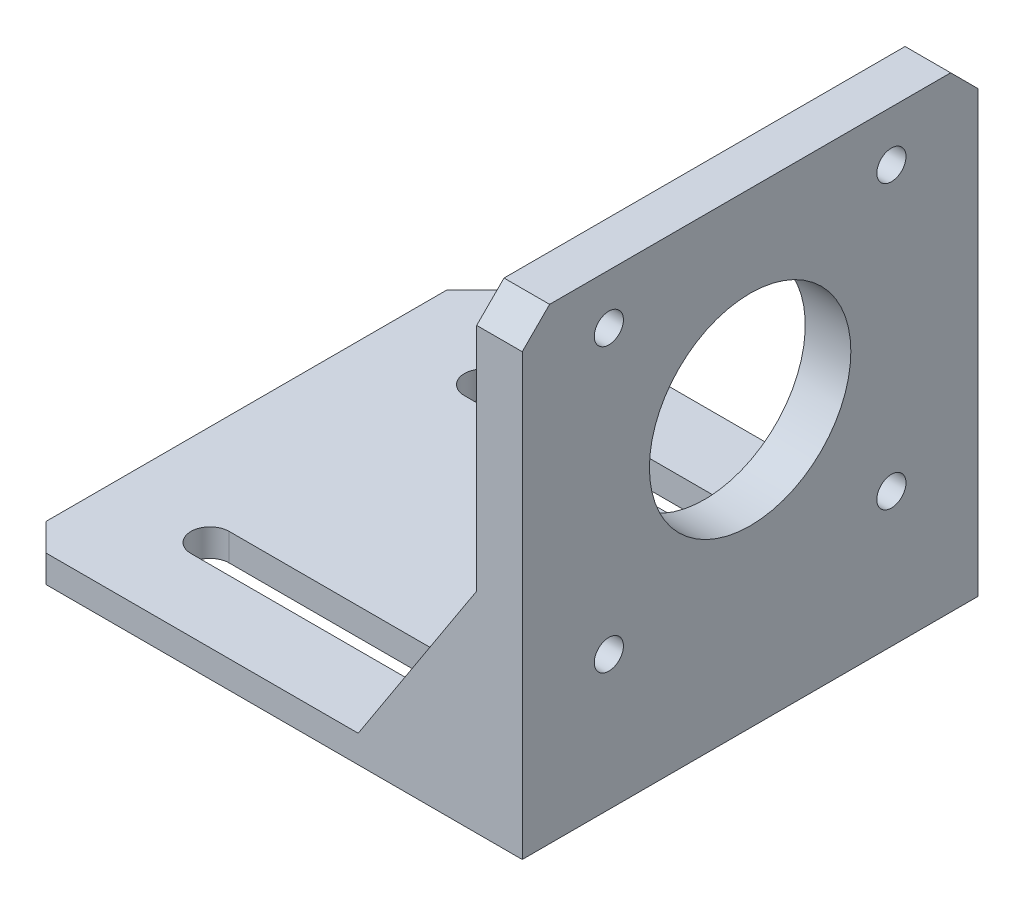
ISO-10303-21;
HEADER;
FILE_DESCRIPTION(('STEP AP214'),'2;1');
FILE_NAME('part.step','',(''),(''),'','','');
FILE_SCHEMA(('AUTOMOTIVE_DESIGN { 1 0 10303 214 1 1 1 1 }'));
ENDSEC;
DATA;
#1=APPLICATION_CONTEXT('core data for automotive mechanical design processes');
#2=APPLICATION_PROTOCOL_DEFINITION('international standard','automotive_design',2000,#1);
#3=PRODUCT_CONTEXT('',#1,'mechanical');
#4=PRODUCT('Part','Part','',(#3));
#5=PRODUCT_RELATED_PRODUCT_CATEGORY('part','',(#4));
#6=PRODUCT_DEFINITION_FORMATION('','',#4);
#7=PRODUCT_DEFINITION_CONTEXT('part definition',#1,'design');
#8=PRODUCT_DEFINITION('design','',#6,#7);
#9=PRODUCT_DEFINITION_SHAPE('','',#8);
#10=(LENGTH_UNIT() NAMED_UNIT(*) SI_UNIT(.MILLI.,.METRE.));
#11=(NAMED_UNIT(*) PLANE_ANGLE_UNIT() SI_UNIT($,.RADIAN.));
#12=(NAMED_UNIT(*) SI_UNIT($,.STERADIAN.) SOLID_ANGLE_UNIT());
#13=UNCERTAINTY_MEASURE_WITH_UNIT(LENGTH_MEASURE(1.E-05),#10,'distance_accuracy_value','');
#14=(GEOMETRIC_REPRESENTATION_CONTEXT(3) GLOBAL_UNCERTAINTY_ASSIGNED_CONTEXT((#13)) GLOBAL_UNIT_ASSIGNED_CONTEXT((#10,
#11,#12)) REPRESENTATION_CONTEXT('',''));
#15=CARTESIAN_POINT('',(0.,0.,0.));
#16=DIRECTION('',(0.,0.,1.));
#17=DIRECTION('',(1.,0.,0.));
#18=AXIS2_PLACEMENT_3D('',#15,#16,#17);
#19=CARTESIAN_POINT('',(0.,-3.,50.));
#20=DIRECTION('',(1.,0.,0.));
#21=DIRECTION('',(0.,0.,-1.));
#22=AXIS2_PLACEMENT_3D('',#19,#20,#21);
#23=PLANE('',#22);
#24=DIRECTION('',(0.,0.,-1.));
#25=VECTOR('',#24,1.);
#26=CARTESIAN_POINT('',(0.,0.,50.));
#27=LINE('',#26,#25);
#28=CARTESIAN_POINT('',(0.,0.,47.));
#29=VERTEX_POINT('',#28);
#30=CARTESIAN_POINT('',(0.,0.,3.00000000000002));
#31=VERTEX_POINT('',#30);
#32=EDGE_CURVE('E476',#29,#31,#27,.T.);
#33=ORIENTED_EDGE('',*,*,#32,.T.);
#34=DIRECTION('',(0.,-1.,0.));
#35=VECTOR('',#34,1.);
#36=CARTESIAN_POINT('',(0.,-3.,3.00000000000002));
#37=LINE('',#36,#35);
#38=CARTESIAN_POINT('',(0.,-3.,3.00000000000002));
#39=VERTEX_POINT('',#38);
#40=EDGE_CURVE('E520',#31,#39,#37,.T.);
#41=ORIENTED_EDGE('',*,*,#40,.T.);
#42=DIRECTION('',(0.,0.,-1.));
#43=VECTOR('',#42,1.);
#44=CARTESIAN_POINT('',(0.,-3.,50.));
#45=LINE('',#44,#43);
#46=CARTESIAN_POINT('',(0.,-3.,47.));
#47=VERTEX_POINT('',#46);
#48=EDGE_CURVE('E487',#47,#39,#45,.T.);
#49=ORIENTED_EDGE('',*,*,#48,.F.);
#50=DIRECTION('',(0.,1.,0.));
#51=VECTOR('',#50,1.);
#52=CARTESIAN_POINT('',(0.,-3.,47.));
#53=LINE('',#52,#51);
#54=EDGE_CURVE('E518',#47,#29,#53,.T.);
#55=ORIENTED_EDGE('',*,*,#54,.T.);
#56=EDGE_LOOP('',(#33,#41,#49,#55));
#57=FACE_BOUND('',#56,.T.);
#58=ADVANCED_FACE('F189',(#57),#23,.F.);
#59=CARTESIAN_POINT('',(53.25,-2.99999999999999,50.));
#60=DIRECTION('',(0.,1.,0.));
#61=DIRECTION('',(-1.,0.,0.));
#62=AXIS2_PLACEMENT_3D('',#59,#60,#61);
#63=PLANE('',#62);
#64=ORIENTED_EDGE('',*,*,#48,.T.);
#65=DIRECTION('',(0.707106781186548,0.,-0.707106781186548));
#66=VECTOR('',#65,1.);
#67=CARTESIAN_POINT('',(0.,-3.,3.00000000000002));
#68=LINE('',#67,#66);
#69=CARTESIAN_POINT('',(3.00000000000002,-3.,0.));
#70=VERTEX_POINT('',#69);
#71=EDGE_CURVE('E525',#39,#70,#68,.T.);
#72=ORIENTED_EDGE('',*,*,#71,.T.);
#73=DIRECTION('',(1.,0.,0.));
#74=VECTOR('',#73,1.);
#75=CARTESIAN_POINT('',(53.25,-2.99999999999999,0.));
#76=LINE('',#75,#74);
#77=CARTESIAN_POINT('',(55.25,-2.99999999999999,0.));
#78=VERTEX_POINT('',#77);
#79=EDGE_CURVE('E469',#70,#78,#76,.T.);
#80=ORIENTED_EDGE('',*,*,#79,.T.);
#81=DIRECTION('',(0.,0.,-1.));
#82=VECTOR('',#81,1.);
#83=CARTESIAN_POINT('',(55.25,-2.99999999999999,0.));
#84=LINE('',#83,#82);
#85=CARTESIAN_POINT('',(55.25,-2.99999999999999,50.));
#86=VERTEX_POINT('',#85);
#87=EDGE_CURVE('E366',#86,#78,#84,.T.);
#88=ORIENTED_EDGE('',*,*,#87,.F.);
#89=DIRECTION('',(1.,0.,0.));
#90=VECTOR('',#89,1.);
#91=CARTESIAN_POINT('',(53.25,-2.99999999999999,50.));
#92=LINE('',#91,#90);
#93=CARTESIAN_POINT('',(3.00000000000002,-3.,50.));
#94=VERTEX_POINT('',#93);
#95=EDGE_CURVE('E362',#94,#86,#92,.T.);
#96=ORIENTED_EDGE('',*,*,#95,.F.);
#97=DIRECTION('',(0.707106781186548,0.,0.707106781186548));
#98=VECTOR('',#97,1.);
#99=CARTESIAN_POINT('',(3.00000000000002,-3.,50.));
#100=LINE('',#99,#98);
#101=EDGE_CURVE('E523',#94,#47,#100,.F.);
#102=ORIENTED_EDGE('',*,*,#101,.T.);
#103=EDGE_LOOP('',(#64,#72,#80,#88,#96,#102));
#104=FACE_BOUND('',#103,.T.);
#105=CARTESIAN_POINT('',(41.,-2.99999999999999,10.));
#106=DIRECTION('',(0.,1.,0.));
#107=DIRECTION('',(-1.,0.,0.));
#108=AXIS2_PLACEMENT_3D('',#105,#106,#107);
#109=CIRCLE('',#108,2.1);
#110=CARTESIAN_POINT('',(41.,-2.99999999999999,12.1));
#111=VERTEX_POINT('',#110);
#112=CARTESIAN_POINT('',(41.,-3.,7.9));
#113=VERTEX_POINT('',#112);
#114=EDGE_CURVE('E508',#111,#113,#109,.T.);
#115=ORIENTED_EDGE('',*,*,#114,.T.);
#116=DIRECTION('',(-1.,0.,0.));
#117=VECTOR('',#116,1.);
#118=CARTESIAN_POINT('',(53.25,-2.99999999999999,7.9));
#119=LINE('',#118,#117);
#120=CARTESIAN_POINT('',(11.,-3.,7.9));
#121=VERTEX_POINT('',#120);
#122=EDGE_CURVE('E511',#113,#121,#119,.T.);
#123=ORIENTED_EDGE('',*,*,#122,.T.);
#124=CARTESIAN_POINT('',(11.,-3.,10.));
#125=DIRECTION('',(0.,1.,0.));
#126=DIRECTION('',(-1.,0.,0.));
#127=AXIS2_PLACEMENT_3D('',#124,#125,#126);
#128=CIRCLE('',#127,2.1);
#129=CARTESIAN_POINT('',(11.,-3.,12.1));
#130=VERTEX_POINT('',#129);
#131=EDGE_CURVE('E505',#121,#130,#128,.T.);
#132=ORIENTED_EDGE('',*,*,#131,.T.);
#133=DIRECTION('',(1.,0.,0.));
#134=VECTOR('',#133,1.);
#135=CARTESIAN_POINT('',(53.25,-2.99999999999999,12.1));
#136=LINE('',#135,#134);
#137=EDGE_CURVE('E502',#130,#111,#136,.T.);
#138=ORIENTED_EDGE('',*,*,#137,.T.);
#139=EDGE_LOOP('',(#115,#123,#132,#138));
#140=FACE_BOUND('',#139,.T.);
#141=CARTESIAN_POINT('',(41.,-2.99999999999999,40.));
#142=DIRECTION('',(0.,1.,0.));
#143=DIRECTION('',(-1.,0.,0.));
#144=AXIS2_PLACEMENT_3D('',#141,#142,#143);
#145=CIRCLE('',#144,2.1);
#146=CARTESIAN_POINT('',(41.,-3.,42.1));
#147=VERTEX_POINT('',#146);
#148=CARTESIAN_POINT('',(41.,-3.,37.9));
#149=VERTEX_POINT('',#148);
#150=EDGE_CURVE('E496',#147,#149,#145,.T.);
#151=ORIENTED_EDGE('',*,*,#150,.T.);
#152=DIRECTION('',(-1.,0.,0.));
#153=VECTOR('',#152,1.);
#154=CARTESIAN_POINT('',(53.25,-2.99999999999999,37.9));
#155=LINE('',#154,#153);
#156=CARTESIAN_POINT('',(11.,-3.,37.9));
#157=VERTEX_POINT('',#156);
#158=EDGE_CURVE('E499',#149,#157,#155,.T.);
#159=ORIENTED_EDGE('',*,*,#158,.T.);
#160=CARTESIAN_POINT('',(11.,-3.,40.));
#161=DIRECTION('',(0.,1.,0.));
#162=DIRECTION('',(-1.,0.,0.));
#163=AXIS2_PLACEMENT_3D('',#160,#161,#162);
#164=CIRCLE('',#163,2.1);
#165=CARTESIAN_POINT('',(11.,-3.,42.1));
#166=VERTEX_POINT('',#165);
#167=EDGE_CURVE('E493',#157,#166,#164,.T.);
#168=ORIENTED_EDGE('',*,*,#167,.T.);
#169=DIRECTION('',(1.,0.,0.));
#170=VECTOR('',#169,1.);
#171=CARTESIAN_POINT('',(53.25,-2.99999999999999,42.1));
#172=LINE('',#171,#170);
#173=EDGE_CURVE('E490',#166,#147,#172,.T.);
#174=ORIENTED_EDGE('',*,*,#173,.T.);
#175=EDGE_LOOP('',(#151,#159,#168,#174));
#176=FACE_BOUND('',#175,.T.);
#177=ADVANCED_FACE('F600',(#104,#140,#176),#63,.F.);
#178=CARTESIAN_POINT('',(50.25,48.25,50.));
#179=DIRECTION('',(0.,-1.,0.));
#180=DIRECTION('',(0.,0.,-1.));
#181=AXIS2_PLACEMENT_3D('',#178,#179,#180);
#182=PLANE('',#181);
#183=DIRECTION('',(1.,0.,0.));
#184=VECTOR('',#183,1.);
#185=CARTESIAN_POINT('',(50.25,48.25,47.));
#186=LINE('',#185,#184);
#187=CARTESIAN_POINT('',(50.25,48.25,47.));
#188=VERTEX_POINT('',#187);
#189=CARTESIAN_POINT('',(55.25,48.25,47.));
#190=VERTEX_POINT('',#189);
#191=EDGE_CURVE('E535',#188,#190,#186,.T.);
#192=ORIENTED_EDGE('',*,*,#191,.T.);
#193=DIRECTION('',(0.,0.,1.));
#194=VECTOR('',#193,1.);
#195=CARTESIAN_POINT('',(55.25,48.25,47.));
#196=LINE('',#195,#194);
#197=CARTESIAN_POINT('',(55.25,48.25,3.00000000000002));
#198=VERTEX_POINT('',#197);
#199=EDGE_CURVE('E373',#198,#190,#196,.T.);
#200=ORIENTED_EDGE('',*,*,#199,.F.);
#201=DIRECTION('',(-1.,0.,0.));
#202=VECTOR('',#201,1.);
#203=CARTESIAN_POINT('',(50.25,48.25,3.00000000000002));
#204=LINE('',#203,#202);
#205=CARTESIAN_POINT('',(50.25,48.25,3.00000000000002));
#206=VERTEX_POINT('',#205);
#207=EDGE_CURVE('E537',#198,#206,#204,.T.);
#208=ORIENTED_EDGE('',*,*,#207,.T.);
#209=DIRECTION('',(0.,0.,-1.));
#210=VECTOR('',#209,1.);
#211=CARTESIAN_POINT('',(50.25,48.25,50.));
#212=LINE('',#211,#210);
#213=EDGE_CURVE('E484',#188,#206,#212,.T.);
#214=ORIENTED_EDGE('',*,*,#213,.F.);
#215=EDGE_LOOP('',(#192,#200,#208,#214));
#216=FACE_BOUND('',#215,.T.);
#217=ADVANCED_FACE('F589',(#216),#182,.F.);
#218=CARTESIAN_POINT('',(50.25,0.,50.));
#219=DIRECTION('',(1.,0.,0.));
#220=DIRECTION('',(0.,0.,-1.));
#221=AXIS2_PLACEMENT_3D('',#218,#219,#220);
#222=PLANE('',#221);
#223=CARTESIAN_POINT('',(50.25,42.75,9.5));
#224=DIRECTION('',(-1.,0.,0.));
#225=DIRECTION('',(0.,0.,1.));
#226=AXIS2_PLACEMENT_3D('',#223,#224,#225);
#227=CIRCLE('',#226,1.60000000000002);
#228=CARTESIAN_POINT('',(50.25,42.75,11.1));
#229=VERTEX_POINT('',#228);
#230=EDGE_CURVE('E454',#229,#229,#227,.T.);
#231=ORIENTED_EDGE('',*,*,#230,.F.);
#232=EDGE_LOOP('',(#231));
#233=FACE_BOUND('',#232,.T.);
#234=CARTESIAN_POINT('',(50.25,42.75,40.5));
#235=DIRECTION('',(-1.,0.,0.));
#236=DIRECTION('',(0.,0.,1.));
#237=AXIS2_PLACEMENT_3D('',#234,#235,#236);
#238=CIRCLE('',#237,1.60000000000002);
#239=CARTESIAN_POINT('',(50.25,42.75,42.1));
#240=VERTEX_POINT('',#239);
#241=EDGE_CURVE('E457',#240,#240,#238,.T.);
#242=ORIENTED_EDGE('',*,*,#241,.F.);
#243=EDGE_LOOP('',(#242));
#244=FACE_BOUND('',#243,.T.);
#245=CARTESIAN_POINT('',(50.25,11.75,40.5));
#246=DIRECTION('',(-1.,0.,0.));
#247=DIRECTION('',(0.,0.,1.));
#248=AXIS2_PLACEMENT_3D('',#245,#246,#247);
#249=CIRCLE('',#248,1.60000000000001);
#250=CARTESIAN_POINT('',(50.25,11.75,42.1));
#251=VERTEX_POINT('',#250);
#252=EDGE_CURVE('E460',#251,#251,#249,.T.);
#253=ORIENTED_EDGE('',*,*,#252,.F.);
#254=EDGE_LOOP('',(#253));
#255=FACE_BOUND('',#254,.T.);
#256=CARTESIAN_POINT('',(50.25,11.75,9.50000000000001));
#257=DIRECTION('',(-1.,0.,0.));
#258=DIRECTION('',(0.,0.,1.));
#259=AXIS2_PLACEMENT_3D('',#256,#257,#258);
#260=CIRCLE('',#259,1.60000000000001);
#261=CARTESIAN_POINT('',(50.25,11.75,11.1));
#262=VERTEX_POINT('',#261);
#263=EDGE_CURVE('E463',#262,#262,#260,.T.);
#264=ORIENTED_EDGE('',*,*,#263,.F.);
#265=EDGE_LOOP('',(#264));
#266=FACE_BOUND('',#265,.T.);
#267=CARTESIAN_POINT('',(50.25,27.25,25.));
#268=DIRECTION('',(-1.,0.,0.));
#269=DIRECTION('',(0.,0.,1.));
#270=AXIS2_PLACEMENT_3D('',#267,#268,#269);
#271=CIRCLE('',#270,11.05);
#272=CARTESIAN_POINT('',(50.25,27.25,36.05));
#273=VERTEX_POINT('',#272);
#274=EDGE_CURVE('E466',#273,#273,#271,.T.);
#275=ORIENTED_EDGE('',*,*,#274,.F.);
#276=EDGE_LOOP('',(#275));
#277=FACE_BOUND('',#276,.T.);
#278=DIRECTION('',(0.,1.,0.));
#279=VECTOR('',#278,1.);
#280=CARTESIAN_POINT('',(50.25,0.,2.1));
#281=LINE('',#280,#279);
#282=CARTESIAN_POINT('',(50.25,4.99999999999999,2.1));
#283=VERTEX_POINT('',#282);
#284=CARTESIAN_POINT('',(50.25,20.,2.1));
#285=VERTEX_POINT('',#284);
#286=EDGE_CURVE('E399',#283,#285,#281,.T.);
#287=ORIENTED_EDGE('',*,*,#286,.F.);
#288=DIRECTION('',(0.,0.,1.));
#289=VECTOR('',#288,1.);
#290=CARTESIAN_POINT('',(50.25,4.99999999999999,47.9));
#291=LINE('',#290,#289);
#292=CARTESIAN_POINT('',(50.25,4.99999999999999,47.9));
#293=VERTEX_POINT('',#292);
#294=EDGE_CURVE('E198',#283,#293,#291,.T.);
#295=ORIENTED_EDGE('',*,*,#294,.T.);
#296=DIRECTION('',(0.,-1.,0.));
#297=VECTOR('',#296,1.);
#298=CARTESIAN_POINT('',(50.25,0.,47.9));
#299=LINE('',#298,#297);
#300=CARTESIAN_POINT('',(50.25,20.,47.9));
#301=VERTEX_POINT('',#300);
#302=EDGE_CURVE('E412',#301,#293,#299,.T.);
#303=ORIENTED_EDGE('',*,*,#302,.F.);
#304=DIRECTION('',(0.,0.,1.));
#305=VECTOR('',#304,1.);
#306=CARTESIAN_POINT('',(50.25,20.,50.));
#307=LINE('',#306,#305);
#308=CARTESIAN_POINT('',(50.25,20.,50.));
#309=VERTEX_POINT('',#308);
#310=EDGE_CURVE('E409',#301,#309,#307,.T.);
#311=ORIENTED_EDGE('',*,*,#310,.T.);
#312=DIRECTION('',(0.,-1.,0.));
#313=VECTOR('',#312,1.);
#314=CARTESIAN_POINT('',(50.25,0.,50.));
#315=LINE('',#314,#313);
#316=CARTESIAN_POINT('',(50.25,45.25,50.));
#317=VERTEX_POINT('',#316);
#318=EDGE_CURVE('E471',#317,#309,#315,.T.);
#319=ORIENTED_EDGE('',*,*,#318,.F.);
#320=DIRECTION('',(0.,-0.707106781186546,0.707106781186549));
#321=VECTOR('',#320,1.);
#322=CARTESIAN_POINT('',(50.25,45.25,50.));
#323=LINE('',#322,#321);
#324=EDGE_CURVE('E350',#317,#188,#323,.F.);
#325=ORIENTED_EDGE('',*,*,#324,.T.);
#326=ORIENTED_EDGE('',*,*,#213,.T.);
#327=DIRECTION('',(0.,-0.707106781186548,-0.707106781186548));
#328=VECTOR('',#327,1.);
#329=CARTESIAN_POINT('',(50.25,48.25,3.00000000000002));
#330=LINE('',#329,#328);
#331=CARTESIAN_POINT('',(50.25,45.25,0.));
#332=VERTEX_POINT('',#331);
#333=EDGE_CURVE('E541',#206,#332,#330,.T.);
#334=ORIENTED_EDGE('',*,*,#333,.T.);
#335=DIRECTION('',(0.,-1.,0.));
#336=VECTOR('',#335,1.);
#337=CARTESIAN_POINT('',(50.25,0.,0.));
#338=LINE('',#337,#336);
#339=CARTESIAN_POINT('',(50.25,20.,0.));
#340=VERTEX_POINT('',#339);
#341=EDGE_CURVE('E478',#332,#340,#338,.T.);
#342=ORIENTED_EDGE('',*,*,#341,.T.);
#343=DIRECTION('',(0.,0.,-1.));
#344=VECTOR('',#343,1.);
#345=CARTESIAN_POINT('',(50.25,20.,50.));
#346=LINE('',#345,#344);
#347=EDGE_CURVE('E396',#340,#285,#346,.F.);
#348=ORIENTED_EDGE('',*,*,#347,.T.);
#349=EDGE_LOOP('',(#287,#295,#303,#311,#319,#325,#326,#334,#342,#348));
#350=FACE_BOUND('',#349,.T.);
#351=ADVANCED_FACE('F586',(#233,#244,#255,#266,#277,#350),#222,.F.);
#352=CARTESIAN_POINT('',(0.,0.,50.));
#353=DIRECTION('',(0.,-1.,0.));
#354=DIRECTION('',(0.,0.,-1.));
#355=AXIS2_PLACEMENT_3D('',#352,#353,#354);
#356=PLANE('',#355);
#357=CARTESIAN_POINT('',(41.,0.,10.));
#358=DIRECTION('',(0.,1.,0.));
#359=DIRECTION('',(0.,0.,1.));
#360=AXIS2_PLACEMENT_3D('',#357,#358,#359);
#361=CIRCLE('',#360,2.1);
#362=CARTESIAN_POINT('',(41.,0.,12.1));
#363=VERTEX_POINT('',#362);
#364=CARTESIAN_POINT('',(41.,0.,7.9));
#365=VERTEX_POINT('',#364);
#366=EDGE_CURVE('E427',#363,#365,#361,.T.);
#367=ORIENTED_EDGE('',*,*,#366,.F.);
#368=DIRECTION('',(1.,0.,0.));
#369=VECTOR('',#368,1.);
#370=CARTESIAN_POINT('',(11.,0.,12.1));
#371=LINE('',#370,#369);
#372=CARTESIAN_POINT('',(11.,0.,12.1));
#373=VERTEX_POINT('',#372);
#374=EDGE_CURVE('E414',#373,#363,#371,.T.);
#375=ORIENTED_EDGE('',*,*,#374,.F.);
#376=CARTESIAN_POINT('',(11.,0.,10.));
#377=DIRECTION('',(0.,1.,0.));
#378=DIRECTION('',(0.,0.,1.));
#379=AXIS2_PLACEMENT_3D('',#376,#377,#378);
#380=CIRCLE('',#379,2.1);
#381=CARTESIAN_POINT('',(11.,0.,7.9));
#382=VERTEX_POINT('',#381);
#383=EDGE_CURVE('E419',#382,#373,#380,.T.);
#384=ORIENTED_EDGE('',*,*,#383,.F.);
#385=DIRECTION('',(1.,0.,0.));
#386=VECTOR('',#385,1.);
#387=CARTESIAN_POINT('',(11.,0.,7.9));
#388=LINE('',#387,#386);
#389=EDGE_CURVE('E416',#382,#365,#388,.T.);
#390=ORIENTED_EDGE('',*,*,#389,.T.);
#391=EDGE_LOOP('',(#367,#375,#384,#390));
#392=FACE_BOUND('',#391,.T.);
#393=CARTESIAN_POINT('',(41.,0.,40.));
#394=DIRECTION('',(0.,1.,0.));
#395=DIRECTION('',(0.,0.,1.));
#396=AXIS2_PLACEMENT_3D('',#393,#394,#395);
#397=CIRCLE('',#396,2.1);
#398=CARTESIAN_POINT('',(41.,0.,42.1));
#399=VERTEX_POINT('',#398);
#400=CARTESIAN_POINT('',(41.,0.,37.9));
#401=VERTEX_POINT('',#400);
#402=EDGE_CURVE('E446',#399,#401,#397,.T.);
#403=ORIENTED_EDGE('',*,*,#402,.F.);
#404=DIRECTION('',(1.,0.,0.));
#405=VECTOR('',#404,1.);
#406=CARTESIAN_POINT('',(11.,0.,42.1));
#407=LINE('',#406,#405);
#408=CARTESIAN_POINT('',(11.,0.,42.1));
#409=VERTEX_POINT('',#408);
#410=EDGE_CURVE('E434',#409,#399,#407,.T.);
#411=ORIENTED_EDGE('',*,*,#410,.F.);
#412=CARTESIAN_POINT('',(11.,0.,40.));
#413=DIRECTION('',(0.,1.,0.));
#414=DIRECTION('',(0.,0.,1.));
#415=AXIS2_PLACEMENT_3D('',#412,#413,#414);
#416=CIRCLE('',#415,2.1);
#417=CARTESIAN_POINT('',(11.,0.,37.9));
#418=VERTEX_POINT('',#417);
#419=EDGE_CURVE('E439',#418,#409,#416,.T.);
#420=ORIENTED_EDGE('',*,*,#419,.F.);
#421=DIRECTION('',(1.,0.,0.));
#422=VECTOR('',#421,1.);
#423=CARTESIAN_POINT('',(11.,0.,37.9));
#424=LINE('',#423,#422);
#425=EDGE_CURVE('E436',#418,#401,#424,.T.);
#426=ORIENTED_EDGE('',*,*,#425,.T.);
#427=EDGE_LOOP('',(#403,#411,#420,#426));
#428=FACE_BOUND('',#427,.T.);
#429=DIRECTION('',(-1.,0.,0.));
#430=VECTOR('',#429,1.);
#431=CARTESIAN_POINT('',(0.,0.,47.9));
#432=LINE('',#431,#430);
#433=CARTESIAN_POINT('',(45.2499999999999,0.,47.9));
#434=VERTEX_POINT('',#433);
#435=CARTESIAN_POINT('',(37.25,0.,47.9));
#436=VERTEX_POINT('',#435);
#437=EDGE_CURVE('E514',#434,#436,#432,.T.);
#438=ORIENTED_EDGE('',*,*,#437,.F.);
#439=DIRECTION('',(0.,0.,-1.));
#440=VECTOR('',#439,1.);
#441=CARTESIAN_POINT('',(45.2499999999999,0.,2.1));
#442=LINE('',#441,#440);
#443=CARTESIAN_POINT('',(45.2499999999999,0.,2.1));
#444=VERTEX_POINT('',#443);
#445=EDGE_CURVE('E543',#434,#444,#442,.T.);
#446=ORIENTED_EDGE('',*,*,#445,.T.);
#447=DIRECTION('',(1.,0.,0.));
#448=VECTOR('',#447,1.);
#449=CARTESIAN_POINT('',(0.,0.,2.1));
#450=LINE('',#449,#448);
#451=CARTESIAN_POINT('',(37.25,0.,2.1));
#452=VERTEX_POINT('',#451);
#453=EDGE_CURVE('E516',#452,#444,#450,.T.);
#454=ORIENTED_EDGE('',*,*,#453,.F.);
#455=DIRECTION('',(0.,0.,1.));
#456=VECTOR('',#455,1.);
#457=CARTESIAN_POINT('',(37.25,0.,50.));
#458=LINE('',#457,#456);
#459=CARTESIAN_POINT('',(37.25,0.,0.));
#460=VERTEX_POINT('',#459);
#461=EDGE_CURVE('E392',#452,#460,#458,.F.);
#462=ORIENTED_EDGE('',*,*,#461,.T.);
#463=DIRECTION('',(-1.,0.,0.));
#464=VECTOR('',#463,1.);
#465=CARTESIAN_POINT('',(0.,0.,0.));
#466=LINE('',#465,#464);
#467=CARTESIAN_POINT('',(3.00000000000002,0.,0.));
#468=VERTEX_POINT('',#467);
#469=EDGE_CURVE('E472',#460,#468,#466,.T.);
#470=ORIENTED_EDGE('',*,*,#469,.T.);
#471=DIRECTION('',(-0.707106781186548,0.,0.707106781186548));
#472=VECTOR('',#471,1.);
#473=CARTESIAN_POINT('',(0.,0.,3.00000000000002));
#474=LINE('',#473,#472);
#475=EDGE_CURVE('E354',#468,#31,#474,.T.);
#476=ORIENTED_EDGE('',*,*,#475,.T.);
#477=ORIENTED_EDGE('',*,*,#32,.F.);
#478=DIRECTION('',(-0.707106781186548,0.,-0.707106781186548));
#479=VECTOR('',#478,1.);
#480=CARTESIAN_POINT('',(3.00000000000002,0.,50.));
#481=LINE('',#480,#479);
#482=CARTESIAN_POINT('',(3.00000000000002,0.,50.));
#483=VERTEX_POINT('',#482);
#484=EDGE_CURVE('E531',#29,#483,#481,.F.);
#485=ORIENTED_EDGE('',*,*,#484,.T.);
#486=DIRECTION('',(-1.,0.,0.));
#487=VECTOR('',#486,1.);
#488=CARTESIAN_POINT('',(0.,0.,50.));
#489=LINE('',#488,#487);
#490=CARTESIAN_POINT('',(37.25,0.,50.));
#491=VERTEX_POINT('',#490);
#492=EDGE_CURVE('E474',#491,#483,#489,.T.);
#493=ORIENTED_EDGE('',*,*,#492,.F.);
#494=DIRECTION('',(0.,0.,-1.));
#495=VECTOR('',#494,1.);
#496=CARTESIAN_POINT('',(37.25,0.,50.));
#497=LINE('',#496,#495);
#498=EDGE_CURVE('E404',#491,#436,#497,.T.);
#499=ORIENTED_EDGE('',*,*,#498,.T.);
#500=EDGE_LOOP('',(#438,#446,#454,#462,#470,#476,#477,#485,#493,#499));
#501=FACE_BOUND('',#500,.T.);
#502=ADVANCED_FACE('F549',(#392,#428,#501),#356,.F.);
#503=CARTESIAN_POINT('',(0.,0.,50.));
#504=DIRECTION('',(0.,0.,-1.));
#505=DIRECTION('',(-1.,0.,0.));
#506=AXIS2_PLACEMENT_3D('',#503,#504,#505);
#507=PLANE('',#506);
#508=ORIENTED_EDGE('',*,*,#492,.T.);
#509=DIRECTION('',(0.,-1.,0.));
#510=VECTOR('',#509,1.);
#511=CARTESIAN_POINT('',(3.00000000000002,0.,50.));
#512=LINE('',#511,#510);
#513=EDGE_CURVE('E353',#483,#94,#512,.T.);
#514=ORIENTED_EDGE('',*,*,#513,.T.);
#515=ORIENTED_EDGE('',*,*,#95,.T.);
#516=DIRECTION('',(0.,-1.,0.));
#517=VECTOR('',#516,1.);
#518=CARTESIAN_POINT('',(55.25,-2.99999999999999,50.));
#519=LINE('',#518,#517);
#520=CARTESIAN_POINT('',(55.25,45.25,50.));
#521=VERTEX_POINT('',#520);
#522=EDGE_CURVE('E357',#521,#86,#519,.T.);
#523=ORIENTED_EDGE('',*,*,#522,.F.);
#524=DIRECTION('',(-1.,0.,0.));
#525=VECTOR('',#524,1.);
#526=CARTESIAN_POINT('',(0.,45.25,50.));
#527=LINE('',#526,#525);
#528=EDGE_CURVE('E344',#521,#317,#527,.T.);
#529=ORIENTED_EDGE('',*,*,#528,.T.);
#530=ORIENTED_EDGE('',*,*,#318,.T.);
#531=DIRECTION('',(-0.544988350595414,-0.838443616300637,0.));
#532=VECTOR('',#531,1.);
#533=CARTESIAN_POINT('',(50.25,20.,50.));
#534=LINE('',#533,#532);
#535=EDGE_CURVE('E402',#309,#491,#534,.T.);
#536=ORIENTED_EDGE('',*,*,#535,.T.);
#537=EDGE_LOOP('',(#508,#514,#515,#523,#529,#530,#536));
#538=FACE_BOUND('',#537,.T.);
#539=ADVANCED_FACE('F359',(#538),#507,.F.);
#540=CARTESIAN_POINT('',(0.,0.,0.));
#541=DIRECTION('',(0.,0.,-1.));
#542=DIRECTION('',(-1.,0.,0.));
#543=AXIS2_PLACEMENT_3D('',#540,#541,#542);
#544=PLANE('',#543);
#545=ORIENTED_EDGE('',*,*,#79,.F.);
#546=DIRECTION('',(0.,1.,0.));
#547=VECTOR('',#546,1.);
#548=CARTESIAN_POINT('',(3.00000000000002,0.,0.));
#549=LINE('',#548,#547);
#550=EDGE_CURVE('E529',#70,#468,#549,.T.);
#551=ORIENTED_EDGE('',*,*,#550,.T.);
#552=ORIENTED_EDGE('',*,*,#469,.F.);
#553=DIRECTION('',(-0.544988350595414,-0.838443616300637,0.));
#554=VECTOR('',#553,1.);
#555=CARTESIAN_POINT('',(50.25,20.,0.));
#556=LINE('',#555,#554);
#557=EDGE_CURVE('E389',#340,#460,#556,.T.);
#558=ORIENTED_EDGE('',*,*,#557,.F.);
#559=ORIENTED_EDGE('',*,*,#341,.F.);
#560=DIRECTION('',(1.,0.,0.));
#561=VECTOR('',#560,1.);
#562=CARTESIAN_POINT('',(53.25,45.25,0.));
#563=LINE('',#562,#561);
#564=CARTESIAN_POINT('',(55.25,45.25,0.));
#565=VERTEX_POINT('',#564);
#566=EDGE_CURVE('E527',#332,#565,#563,.T.);
#567=ORIENTED_EDGE('',*,*,#566,.T.);
#568=DIRECTION('',(0.,1.,0.));
#569=VECTOR('',#568,1.);
#570=CARTESIAN_POINT('',(55.25,45.25,0.));
#571=LINE('',#570,#569);
#572=EDGE_CURVE('E382',#78,#565,#571,.T.);
#573=ORIENTED_EDGE('',*,*,#572,.F.);
#574=EDGE_LOOP('',(#545,#551,#552,#558,#559,#567,#573));
#575=FACE_BOUND('',#574,.T.);
#576=ADVANCED_FACE('F563',(#575),#544,.T.);
#577=CARTESIAN_POINT('',(50.25,27.25,25.));
#578=DIRECTION('',(-1.,0.,0.));
#579=DIRECTION('',(0.,0.,1.));
#580=AXIS2_PLACEMENT_3D('',#577,#578,#579);
#581=CYLINDRICAL_SURFACE('',#580,11.05);
#582=ORIENTED_EDGE('',*,*,#274,.T.);
#583=EDGE_LOOP('',(#582));
#584=FACE_BOUND('',#583,.T.);
#585=CARTESIAN_POINT('',(55.25,27.25,25.));
#586=DIRECTION('',(1.,0.,0.));
#587=DIRECTION('',(0.,1.,0.));
#588=AXIS2_PLACEMENT_3D('',#585,#586,#587);
#589=CIRCLE('',#588,11.05);
#590=CARTESIAN_POINT('',(55.25,38.3,25.));
#591=VERTEX_POINT('',#590);
#592=EDGE_CURVE('E977',#591,#591,#589,.T.);
#593=ORIENTED_EDGE('',*,*,#592,.T.);
#594=EDGE_LOOP('',(#593));
#595=FACE_BOUND('',#594,.T.);
#596=ADVANCED_FACE('F849',(#584,#595),#581,.F.);
#597=CARTESIAN_POINT('',(50.25,11.75,9.50000000000001));
#598=DIRECTION('',(-1.,0.,0.));
#599=DIRECTION('',(0.,0.,1.));
#600=AXIS2_PLACEMENT_3D('',#597,#598,#599);
#601=CYLINDRICAL_SURFACE('',#600,1.60000000000001);
#602=ORIENTED_EDGE('',*,*,#263,.T.);
#603=EDGE_LOOP('',(#602));
#604=FACE_BOUND('',#603,.T.);
#605=CARTESIAN_POINT('',(55.25,11.75,9.50000000000001));
#606=DIRECTION('',(1.,0.,0.));
#607=DIRECTION('',(0.,1.,0.));
#608=AXIS2_PLACEMENT_3D('',#605,#606,#607);
#609=CIRCLE('',#608,1.60000000000001);
#610=CARTESIAN_POINT('',(55.25,13.35,9.50000000000001));
#611=VERTEX_POINT('',#610);
#612=EDGE_CURVE('E979',#611,#611,#609,.T.);
#613=ORIENTED_EDGE('',*,*,#612,.T.);
#614=EDGE_LOOP('',(#613));
#615=FACE_BOUND('',#614,.T.);
#616=ADVANCED_FACE('F839',(#604,#615),#601,.F.);
#617=CARTESIAN_POINT('',(50.25,11.75,40.5));
#618=DIRECTION('',(-1.,0.,0.));
#619=DIRECTION('',(0.,0.,1.));
#620=AXIS2_PLACEMENT_3D('',#617,#618,#619);
#621=CYLINDRICAL_SURFACE('',#620,1.60000000000001);
#622=ORIENTED_EDGE('',*,*,#252,.T.);
#623=EDGE_LOOP('',(#622));
#624=FACE_BOUND('',#623,.T.);
#625=CARTESIAN_POINT('',(55.25,11.75,40.5));
#626=DIRECTION('',(1.,0.,0.));
#627=DIRECTION('',(0.,1.,0.));
#628=AXIS2_PLACEMENT_3D('',#625,#626,#627);
#629=CIRCLE('',#628,1.6);
#630=CARTESIAN_POINT('',(55.25,13.35,40.5));
#631=VERTEX_POINT('',#630);
#632=EDGE_CURVE('E983',#631,#631,#629,.T.);
#633=ORIENTED_EDGE('',*,*,#632,.T.);
#634=EDGE_LOOP('',(#633));
#635=FACE_BOUND('',#634,.T.);
#636=ADVANCED_FACE('F829',(#624,#635),#621,.F.);
#637=CARTESIAN_POINT('',(50.25,42.75,40.5));
#638=DIRECTION('',(-1.,0.,0.));
#639=DIRECTION('',(0.,0.,1.));
#640=AXIS2_PLACEMENT_3D('',#637,#638,#639);
#641=CYLINDRICAL_SURFACE('',#640,1.60000000000001);
#642=ORIENTED_EDGE('',*,*,#241,.T.);
#643=EDGE_LOOP('',(#642));
#644=FACE_BOUND('',#643,.T.);
#645=CARTESIAN_POINT('',(55.25,42.75,40.5));
#646=DIRECTION('',(1.,0.,0.));
#647=DIRECTION('',(0.,1.,0.));
#648=AXIS2_PLACEMENT_3D('',#645,#646,#647);
#649=CIRCLE('',#648,1.60000000000001);
#650=CARTESIAN_POINT('',(55.25,44.35,40.5));
#651=VERTEX_POINT('',#650);
#652=EDGE_CURVE('E377',#651,#651,#649,.T.);
#653=ORIENTED_EDGE('',*,*,#652,.T.);
#654=EDGE_LOOP('',(#653));
#655=FACE_BOUND('',#654,.T.);
#656=ADVANCED_FACE('F819',(#644,#655),#641,.F.);
#657=CARTESIAN_POINT('',(50.25,42.75,9.5));
#658=DIRECTION('',(-1.,0.,0.));
#659=DIRECTION('',(0.,0.,1.));
#660=AXIS2_PLACEMENT_3D('',#657,#658,#659);
#661=CYLINDRICAL_SURFACE('',#660,1.60000000000001);
#662=ORIENTED_EDGE('',*,*,#230,.T.);
#663=EDGE_LOOP('',(#662));
#664=FACE_BOUND('',#663,.T.);
#665=CARTESIAN_POINT('',(55.25,42.75,9.5));
#666=DIRECTION('',(1.,0.,0.));
#667=DIRECTION('',(0.,1.,0.));
#668=AXIS2_PLACEMENT_3D('',#665,#666,#667);
#669=CIRCLE('',#668,1.60000000000001);
#670=CARTESIAN_POINT('',(55.25,44.35,9.5));
#671=VERTEX_POINT('',#670);
#672=EDGE_CURVE('E374',#671,#671,#669,.T.);
#673=ORIENTED_EDGE('',*,*,#672,.T.);
#674=EDGE_LOOP('',(#673));
#675=FACE_BOUND('',#674,.T.);
#676=ADVANCED_FACE('F809',(#664,#675),#661,.F.);
#677=CARTESIAN_POINT('',(41.,0.,40.));
#678=DIRECTION('',(0.,1.,0.));
#679=DIRECTION('',(0.,0.,1.));
#680=AXIS2_PLACEMENT_3D('',#677,#678,#679);
#681=CYLINDRICAL_SURFACE('',#680,2.1);
#682=DIRECTION('',(0.,1.,0.));
#683=VECTOR('',#682,1.);
#684=CARTESIAN_POINT('',(41.,0.,42.1));
#685=LINE('',#684,#683);
#686=EDGE_CURVE('E451',#399,#147,#685,.F.);
#687=ORIENTED_EDGE('',*,*,#686,.F.);
#688=ORIENTED_EDGE('',*,*,#402,.T.);
#689=DIRECTION('',(0.,1.,0.));
#690=VECTOR('',#689,1.);
#691=CARTESIAN_POINT('',(41.,0.,37.9));
#692=LINE('',#691,#690);
#693=EDGE_CURVE('E449',#149,#401,#692,.T.);
#694=ORIENTED_EDGE('',*,*,#693,.F.);
#695=ORIENTED_EDGE('',*,*,#150,.F.);
#696=EDGE_LOOP('',(#687,#688,#694,#695));
#697=FACE_BOUND('',#696,.T.);
#698=ADVANCED_FACE('F799',(#697),#681,.F.);
#699=CARTESIAN_POINT('',(11.,0.,40.));
#700=DIRECTION('',(0.,1.,0.));
#701=DIRECTION('',(0.,0.,1.));
#702=AXIS2_PLACEMENT_3D('',#699,#700,#701);
#703=CYLINDRICAL_SURFACE('',#702,2.1);
#704=DIRECTION('',(0.,1.,0.));
#705=VECTOR('',#704,1.);
#706=CARTESIAN_POINT('',(11.,0.,37.9));
#707=LINE('',#706,#705);
#708=EDGE_CURVE('E444',#418,#157,#707,.F.);
#709=ORIENTED_EDGE('',*,*,#708,.F.);
#710=ORIENTED_EDGE('',*,*,#419,.T.);
#711=DIRECTION('',(0.,1.,0.));
#712=VECTOR('',#711,1.);
#713=CARTESIAN_POINT('',(11.,0.,42.1));
#714=LINE('',#713,#712);
#715=EDGE_CURVE('E442',#166,#409,#714,.T.);
#716=ORIENTED_EDGE('',*,*,#715,.F.);
#717=ORIENTED_EDGE('',*,*,#167,.F.);
#718=EDGE_LOOP('',(#709,#710,#716,#717));
#719=FACE_BOUND('',#718,.T.);
#720=ADVANCED_FACE('F789',(#719),#703,.F.);
#721=CARTESIAN_POINT('',(11.,0.,37.9));
#722=DIRECTION('',(0.,0.,-1.));
#723=DIRECTION('',(-1.,0.,0.));
#724=AXIS2_PLACEMENT_3D('',#721,#722,#723);
#725=PLANE('',#724);
#726=ORIENTED_EDGE('',*,*,#693,.T.);
#727=ORIENTED_EDGE('',*,*,#425,.F.);
#728=ORIENTED_EDGE('',*,*,#708,.T.);
#729=ORIENTED_EDGE('',*,*,#158,.F.);
#730=EDGE_LOOP('',(#726,#727,#728,#729));
#731=FACE_BOUND('',#730,.T.);
#732=ADVANCED_FACE('F779',(#731),#725,.F.);
#733=CARTESIAN_POINT('',(11.,0.,42.1));
#734=DIRECTION('',(0.,0.,1.));
#735=DIRECTION('',(1.,0.,0.));
#736=AXIS2_PLACEMENT_3D('',#733,#734,#735);
#737=PLANE('',#736);
#738=ORIENTED_EDGE('',*,*,#715,.T.);
#739=ORIENTED_EDGE('',*,*,#410,.T.);
#740=ORIENTED_EDGE('',*,*,#686,.T.);
#741=ORIENTED_EDGE('',*,*,#173,.F.);
#742=EDGE_LOOP('',(#738,#739,#740,#741));
#743=FACE_BOUND('',#742,.T.);
#744=ADVANCED_FACE('F769',(#743),#737,.F.);
#745=CARTESIAN_POINT('',(41.,0.,10.));
#746=DIRECTION('',(0.,1.,0.));
#747=DIRECTION('',(0.,0.,1.));
#748=AXIS2_PLACEMENT_3D('',#745,#746,#747);
#749=CYLINDRICAL_SURFACE('',#748,2.1);
#750=DIRECTION('',(0.,1.,0.));
#751=VECTOR('',#750,1.);
#752=CARTESIAN_POINT('',(41.,0.,12.1));
#753=LINE('',#752,#751);
#754=EDGE_CURVE('E432',#363,#111,#753,.F.);
#755=ORIENTED_EDGE('',*,*,#754,.F.);
#756=ORIENTED_EDGE('',*,*,#366,.T.);
#757=DIRECTION('',(0.,1.,0.));
#758=VECTOR('',#757,1.);
#759=CARTESIAN_POINT('',(41.,0.,7.9));
#760=LINE('',#759,#758);
#761=EDGE_CURVE('E430',#113,#365,#760,.T.);
#762=ORIENTED_EDGE('',*,*,#761,.F.);
#763=ORIENTED_EDGE('',*,*,#114,.F.);
#764=EDGE_LOOP('',(#755,#756,#762,#763));
#765=FACE_BOUND('',#764,.T.);
#766=ADVANCED_FACE('F759',(#765),#749,.F.);
#767=CARTESIAN_POINT('',(11.,0.,10.));
#768=DIRECTION('',(0.,1.,0.));
#769=DIRECTION('',(0.,0.,1.));
#770=AXIS2_PLACEMENT_3D('',#767,#768,#769);
#771=CYLINDRICAL_SURFACE('',#770,2.1);
#772=DIRECTION('',(0.,1.,0.));
#773=VECTOR('',#772,1.);
#774=CARTESIAN_POINT('',(11.,0.,7.9));
#775=LINE('',#774,#773);
#776=EDGE_CURVE('E424',#382,#121,#775,.F.);
#777=ORIENTED_EDGE('',*,*,#776,.F.);
#778=ORIENTED_EDGE('',*,*,#383,.T.);
#779=DIRECTION('',(0.,1.,0.));
#780=VECTOR('',#779,1.);
#781=CARTESIAN_POINT('',(11.,0.,12.1));
#782=LINE('',#781,#780);
#783=EDGE_CURVE('E422',#130,#373,#782,.T.);
#784=ORIENTED_EDGE('',*,*,#783,.F.);
#785=ORIENTED_EDGE('',*,*,#131,.F.);
#786=EDGE_LOOP('',(#777,#778,#784,#785));
#787=FACE_BOUND('',#786,.T.);
#788=ADVANCED_FACE('F749',(#787),#771,.F.);
#789=CARTESIAN_POINT('',(11.,0.,7.9));
#790=DIRECTION('',(0.,0.,-1.));
#791=DIRECTION('',(-1.,0.,0.));
#792=AXIS2_PLACEMENT_3D('',#789,#790,#791);
#793=PLANE('',#792);
#794=ORIENTED_EDGE('',*,*,#761,.T.);
#795=ORIENTED_EDGE('',*,*,#389,.F.);
#796=ORIENTED_EDGE('',*,*,#776,.T.);
#797=ORIENTED_EDGE('',*,*,#122,.F.);
#798=EDGE_LOOP('',(#794,#795,#796,#797));
#799=FACE_BOUND('',#798,.T.);
#800=ADVANCED_FACE('F739',(#799),#793,.F.);
#801=CARTESIAN_POINT('',(11.,0.,12.1));
#802=DIRECTION('',(0.,0.,1.));
#803=DIRECTION('',(1.,0.,0.));
#804=AXIS2_PLACEMENT_3D('',#801,#802,#803);
#805=PLANE('',#804);
#806=ORIENTED_EDGE('',*,*,#783,.T.);
#807=ORIENTED_EDGE('',*,*,#374,.T.);
#808=ORIENTED_EDGE('',*,*,#754,.T.);
#809=ORIENTED_EDGE('',*,*,#137,.F.);
#810=EDGE_LOOP('',(#806,#807,#808,#809));
#811=FACE_BOUND('',#810,.T.);
#812=ADVANCED_FACE('F670',(#811),#805,.F.);
#813=CARTESIAN_POINT('',(26.625,22.625,47.9));
#814=DIRECTION('',(0.,0.,1.));
#815=DIRECTION('',(1.,0.,0.));
#816=AXIS2_PLACEMENT_3D('',#813,#814,#815);
#817=PLANE('',#816);
#818=ORIENTED_EDGE('',*,*,#302,.T.);
#819=DIRECTION('',(0.707106781186551,0.707106781186544,0.));
#820=VECTOR('',#819,1.);
#821=CARTESIAN_POINT('',(45.2499999999999,0.,47.9));
#822=LINE('',#821,#820);
#823=EDGE_CURVE('E13',#293,#434,#822,.F.);
#824=ORIENTED_EDGE('',*,*,#823,.T.);
#825=ORIENTED_EDGE('',*,*,#437,.T.);
#826=DIRECTION('',(-0.544988350595414,-0.838443616300637,0.));
#827=VECTOR('',#826,1.);
#828=CARTESIAN_POINT('',(50.25,20.,47.9));
#829=LINE('',#828,#827);
#830=EDGE_CURVE('E401',#301,#436,#829,.T.);
#831=ORIENTED_EDGE('',*,*,#830,.F.);
#832=EDGE_LOOP('',(#818,#824,#825,#831));
#833=FACE_BOUND('',#832,.T.);
#834=ADVANCED_FACE('F585',(#833),#817,.F.);
#835=CARTESIAN_POINT('',(50.25,20.,50.));
#836=DIRECTION('',(-0.838443616300637,0.544988350595414,0.));
#837=DIRECTION('',(-0.544988350595414,-0.838443616300637,0.));
#838=AXIS2_PLACEMENT_3D('',#835,#836,#837);
#839=PLANE('',#838);
#840=ORIENTED_EDGE('',*,*,#310,.F.);
#841=ORIENTED_EDGE('',*,*,#830,.T.);
#842=ORIENTED_EDGE('',*,*,#498,.F.);
#843=ORIENTED_EDGE('',*,*,#535,.F.);
#844=EDGE_LOOP('',(#840,#841,#842,#843));
#845=FACE_BOUND('',#844,.T.);
#846=ADVANCED_FACE('F582',(#845),#839,.T.);
#847=CARTESIAN_POINT('',(26.625,22.625,2.1));
#848=DIRECTION('',(0.,0.,-1.));
#849=DIRECTION('',(-1.,0.,0.));
#850=AXIS2_PLACEMENT_3D('',#847,#848,#849);
#851=PLANE('',#850);
#852=ORIENTED_EDGE('',*,*,#453,.T.);
#853=DIRECTION('',(-0.707106781186551,-0.707106781186544,0.));
#854=VECTOR('',#853,1.);
#855=CARTESIAN_POINT('',(45.2499999999999,0.,2.1));
#856=LINE('',#855,#854);
#857=EDGE_CURVE('E212',#444,#283,#856,.F.);
#858=ORIENTED_EDGE('',*,*,#857,.T.);
#859=ORIENTED_EDGE('',*,*,#286,.T.);
#860=DIRECTION('',(-0.544988350595414,-0.838443616300637,0.));
#861=VECTOR('',#860,1.);
#862=CARTESIAN_POINT('',(50.25,20.,2.1));
#863=LINE('',#862,#861);
#864=EDGE_CURVE('E388',#285,#452,#863,.T.);
#865=ORIENTED_EDGE('',*,*,#864,.T.);
#866=EDGE_LOOP('',(#852,#858,#859,#865));
#867=FACE_BOUND('',#866,.T.);
#868=ADVANCED_FACE('F553',(#867),#851,.F.);
#869=CARTESIAN_POINT('',(50.25,20.,0.));
#870=DIRECTION('',(0.838443616300637,-0.544988350595414,0.));
#871=DIRECTION('',(-0.544988350595414,-0.838443616300637,0.));
#872=AXIS2_PLACEMENT_3D('',#869,#870,#871);
#873=PLANE('',#872);
#874=ORIENTED_EDGE('',*,*,#347,.F.);
#875=ORIENTED_EDGE('',*,*,#557,.T.);
#876=ORIENTED_EDGE('',*,*,#461,.F.);
#877=ORIENTED_EDGE('',*,*,#864,.F.);
#878=EDGE_LOOP('',(#874,#875,#876,#877));
#879=FACE_BOUND('',#878,.T.);
#880=ADVANCED_FACE('F557',(#879),#873,.F.);
#881=CARTESIAN_POINT('',(0.,-3.,3.00000000000002));
#882=DIRECTION('',(-0.707106781186548,0.,-0.707106781186548));
#883=DIRECTION('',(0.,1.,0.));
#884=AXIS2_PLACEMENT_3D('',#881,#882,#883);
#885=PLANE('',#884);
#886=ORIENTED_EDGE('',*,*,#475,.F.);
#887=ORIENTED_EDGE('',*,*,#550,.F.);
#888=ORIENTED_EDGE('',*,*,#71,.F.);
#889=ORIENTED_EDGE('',*,*,#40,.F.);
#890=EDGE_LOOP('',(#886,#887,#888,#889));
#891=FACE_BOUND('',#890,.T.);
#892=ADVANCED_FACE('F568',(#891),#885,.T.);
#893=CARTESIAN_POINT('',(3.00000000000002,0.,50.));
#894=DIRECTION('',(0.707106781186548,0.,-0.707106781186548));
#895=DIRECTION('',(0.,-1.,0.));
#896=AXIS2_PLACEMENT_3D('',#893,#894,#895);
#897=PLANE('',#896);
#898=ORIENTED_EDGE('',*,*,#484,.F.);
#899=ORIENTED_EDGE('',*,*,#54,.F.);
#900=ORIENTED_EDGE('',*,*,#101,.F.);
#901=ORIENTED_EDGE('',*,*,#513,.F.);
#902=EDGE_LOOP('',(#898,#899,#900,#901));
#903=FACE_BOUND('',#902,.T.);
#904=ADVANCED_FACE('F576',(#903),#897,.F.);
#905=CARTESIAN_POINT('',(50.25,48.25,3.00000000000002));
#906=DIRECTION('',(0.,0.707106781186548,-0.707106781186548));
#907=DIRECTION('',(1.,0.,0.));
#908=AXIS2_PLACEMENT_3D('',#905,#906,#907);
#909=PLANE('',#908);
#910=ORIENTED_EDGE('',*,*,#207,.F.);
#911=DIRECTION('',(0.,0.707106781186548,0.707106781186548));
#912=VECTOR('',#911,1.);
#913=CARTESIAN_POINT('',(55.25,48.25,3.00000000000002));
#914=LINE('',#913,#912);
#915=EDGE_CURVE('E385',#565,#198,#914,.T.);
#916=ORIENTED_EDGE('',*,*,#915,.F.);
#917=ORIENTED_EDGE('',*,*,#566,.F.);
#918=ORIENTED_EDGE('',*,*,#333,.F.);
#919=EDGE_LOOP('',(#910,#916,#917,#918));
#920=FACE_BOUND('',#919,.T.);
#921=ADVANCED_FACE('F592',(#920),#909,.T.);
#922=CARTESIAN_POINT('',(0.,45.25,50.));
#923=DIRECTION('',(0.,-0.707106781186549,-0.707106781186546));
#924=DIRECTION('',(-1.,0.,0.));
#925=AXIS2_PLACEMENT_3D('',#922,#923,#924);
#926=PLANE('',#925);
#927=ORIENTED_EDGE('',*,*,#528,.F.);
#928=DIRECTION('',(0.,-0.707106781186546,0.707106781186549));
#929=VECTOR('',#928,1.);
#930=CARTESIAN_POINT('',(55.25,45.25,50.));
#931=LINE('',#930,#929);
#932=EDGE_CURVE('E349',#190,#521,#931,.T.);
#933=ORIENTED_EDGE('',*,*,#932,.F.);
#934=ORIENTED_EDGE('',*,*,#191,.F.);
#935=ORIENTED_EDGE('',*,*,#324,.F.);
#936=EDGE_LOOP('',(#927,#933,#934,#935));
#937=FACE_BOUND('',#936,.T.);
#938=ADVANCED_FACE('F346',(#937),#926,.F.);
#939=CARTESIAN_POINT('',(55.25,0.,0.));
#940=DIRECTION('',(-1.,0.,0.));
#941=DIRECTION('',(0.,0.,1.));
#942=AXIS2_PLACEMENT_3D('',#939,#940,#941);
#943=PLANE('',#942);
#944=ORIENTED_EDGE('',*,*,#932,.T.);
#945=ORIENTED_EDGE('',*,*,#522,.T.);
#946=ORIENTED_EDGE('',*,*,#87,.T.);
#947=ORIENTED_EDGE('',*,*,#572,.T.);
#948=ORIENTED_EDGE('',*,*,#915,.T.);
#949=ORIENTED_EDGE('',*,*,#199,.T.);
#950=EDGE_LOOP('',(#944,#945,#946,#947,#948,#949));
#951=FACE_BOUND('',#950,.T.);
#952=ORIENTED_EDGE('',*,*,#672,.F.);
#953=EDGE_LOOP('',(#952));
#954=FACE_BOUND('',#953,.T.);
#955=ORIENTED_EDGE('',*,*,#652,.F.);
#956=EDGE_LOOP('',(#955));
#957=FACE_BOUND('',#956,.T.);
#958=ORIENTED_EDGE('',*,*,#592,.F.);
#959=EDGE_LOOP('',(#958));
#960=FACE_BOUND('',#959,.T.);
#961=ORIENTED_EDGE('',*,*,#612,.F.);
#962=EDGE_LOOP('',(#961));
#963=FACE_BOUND('',#962,.T.);
#964=ORIENTED_EDGE('',*,*,#632,.F.);
#965=EDGE_LOOP('',(#964));
#966=FACE_BOUND('',#965,.T.);
#967=ADVANCED_FACE('F369',(#951,#954,#957,#960,#963,#966),#943,.F.);
#968=CARTESIAN_POINT('',(45.2499999999999,0.,50.));
#969=DIRECTION('',(-0.707106781186543,0.707106781186551,0.));
#970=DIRECTION('',(0.,0.,1.));
#971=AXIS2_PLACEMENT_3D('',#968,#969,#970);
#972=PLANE('',#971);
#973=ORIENTED_EDGE('',*,*,#823,.F.);
#974=ORIENTED_EDGE('',*,*,#294,.F.);
#975=ORIENTED_EDGE('',*,*,#857,.F.);
#976=ORIENTED_EDGE('',*,*,#445,.F.);
#977=EDGE_LOOP('',(#973,#974,#975,#976));
#978=FACE_BOUND('',#977,.T.);
#979=ADVANCED_FACE('F192',(#978),#972,.T.);
#980=CLOSED_SHELL('',(#58,#177,#217,#351,#502,#539,#576,#596,#616,#636,#656,#676,#698,#720,#732,
#744,#766,#788,#800,#812,#834,#846,#868,#880,#892,#904,#921,#938,#967,#979));
#981=MANIFOLD_SOLID_BREP('B2',#980);
#982=ADVANCED_BREP_SHAPE_REPRESENTATION('',(#18,#981),#14);
#983=SHAPE_DEFINITION_REPRESENTATION(#9,#982);
ENDSEC;
END-ISO-10303-21;
